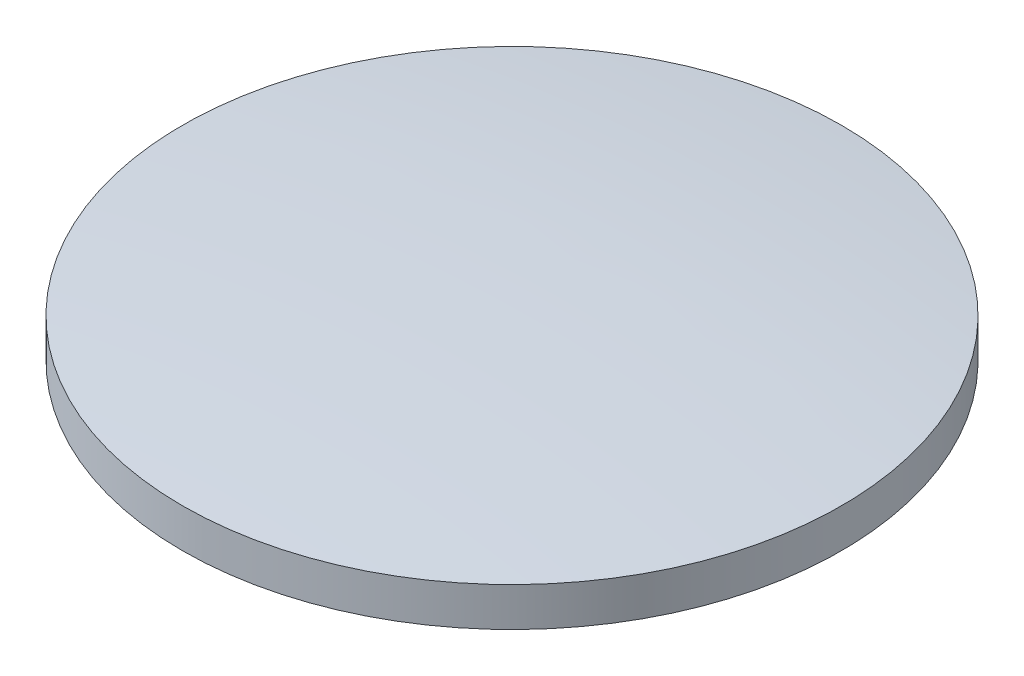
ISO-10303-21;
HEADER;
FILE_DESCRIPTION(('STEP AP214'),'2;1');
FILE_NAME('part.step','',(''),(''),'','','');
FILE_SCHEMA(('AUTOMOTIVE_DESIGN { 1 0 10303 214 1 1 1 1 }'));
ENDSEC;
DATA;
#1=APPLICATION_CONTEXT('core data for automotive mechanical design processes');
#2=APPLICATION_PROTOCOL_DEFINITION('international standard','automotive_design',2000,#1);
#3=PRODUCT_CONTEXT('',#1,'mechanical');
#4=PRODUCT('Part','Part','',(#3));
#5=PRODUCT_RELATED_PRODUCT_CATEGORY('part','',(#4));
#6=PRODUCT_DEFINITION_FORMATION('','',#4);
#7=PRODUCT_DEFINITION_CONTEXT('part definition',#1,'design');
#8=PRODUCT_DEFINITION('design','',#6,#7);
#9=PRODUCT_DEFINITION_SHAPE('','',#8);
#10=(LENGTH_UNIT() NAMED_UNIT(*) SI_UNIT(.MILLI.,.METRE.));
#11=(NAMED_UNIT(*) PLANE_ANGLE_UNIT() SI_UNIT($,.RADIAN.));
#12=(NAMED_UNIT(*) SI_UNIT($,.STERADIAN.) SOLID_ANGLE_UNIT());
#13=UNCERTAINTY_MEASURE_WITH_UNIT(LENGTH_MEASURE(1.E-05),#10,'distance_accuracy_value','');
#14=(GEOMETRIC_REPRESENTATION_CONTEXT(3) GLOBAL_UNCERTAINTY_ASSIGNED_CONTEXT((#13)) GLOBAL_UNIT_ASSIGNED_CONTEXT((#10,
#11,#12)) REPRESENTATION_CONTEXT('',''));
#15=CARTESIAN_POINT('',(0.,0.,0.));
#16=DIRECTION('',(0.,0.,1.));
#17=DIRECTION('',(1.,0.,0.));
#18=AXIS2_PLACEMENT_3D('',#15,#16,#17);
#19=CARTESIAN_POINT('',(0.,-228.36,0.));
#20=DIRECTION('',(1.,0.,0.));
#21=DIRECTION('',(0.,1.,0.));
#22=AXIS2_PLACEMENT_3D('',#19,#20,#21);
#23=SPHERICAL_SURFACE('',#22,228.36);
#24=CARTESIAN_POINT('',(0.,-1.3725783220577,0.));
#25=DIRECTION('',(0.,1.,0.));
#26=DIRECTION('',(0.,0.,1.));
#27=AXIS2_PLACEMENT_3D('',#24,#25,#26);
#28=CIRCLE('',#27,25.);
#29=CARTESIAN_POINT('',(0.,-1.3725783220577,25.));
#30=VERTEX_POINT('',#29);
#31=EDGE_CURVE('E18',#30,#30,#28,.F.);
#32=ORIENTED_EDGE('',*,*,#31,.F.);
#33=EDGE_LOOP('',(#32));
#34=FACE_BOUND('',#33,.T.);
#35=ADVANCED_FACE('F14',(#34),#23,.T.);
#36=CARTESIAN_POINT('',(0.,-2.85000000000001,0.));
#37=DIRECTION('',(0.,1.,0.));
#38=DIRECTION('',(0.,0.,1.));
#39=AXIS2_PLACEMENT_3D('',#36,#37,#38);
#40=CYLINDRICAL_SURFACE('',#39,25.);
#41=CARTESIAN_POINT('',(0.,-4.32742167794233,0.));
#42=DIRECTION('',(0.,1.,0.));
#43=DIRECTION('',(0.,0.,1.));
#44=AXIS2_PLACEMENT_3D('',#41,#42,#43);
#45=CIRCLE('',#44,25.);
#46=CARTESIAN_POINT('',(0.,-4.32742167794233,25.));
#47=VERTEX_POINT('',#46);
#48=EDGE_CURVE('E10',#47,#47,#45,.F.);
#49=ORIENTED_EDGE('',*,*,#48,.F.);
#50=EDGE_LOOP('',(#49));
#51=FACE_BOUND('',#50,.T.);
#52=ORIENTED_EDGE('',*,*,#31,.T.);
#53=EDGE_LOOP('',(#52));
#54=FACE_BOUND('',#53,.T.);
#55=ADVANCED_FACE('F34',(#51,#54),#40,.T.);
#56=CARTESIAN_POINT('',(0.,222.66,0.));
#57=DIRECTION('',(1.,0.,0.));
#58=DIRECTION('',(0.,1.,0.));
#59=AXIS2_PLACEMENT_3D('',#56,#57,#58);
#60=SPHERICAL_SURFACE('',#59,228.36);
#61=ORIENTED_EDGE('',*,*,#48,.T.);
#62=EDGE_LOOP('',(#61));
#63=FACE_BOUND('',#62,.T.);
#64=ADVANCED_FACE('F32',(#63),#60,.T.);
#65=CLOSED_SHELL('',(#35,#55,#64));
#66=MANIFOLD_SOLID_BREP('B1',#65);
#67=ADVANCED_BREP_SHAPE_REPRESENTATION('',(#18,#66),#14);
#68=SHAPE_DEFINITION_REPRESENTATION(#9,#67);
ENDSEC;
END-ISO-10303-21;
